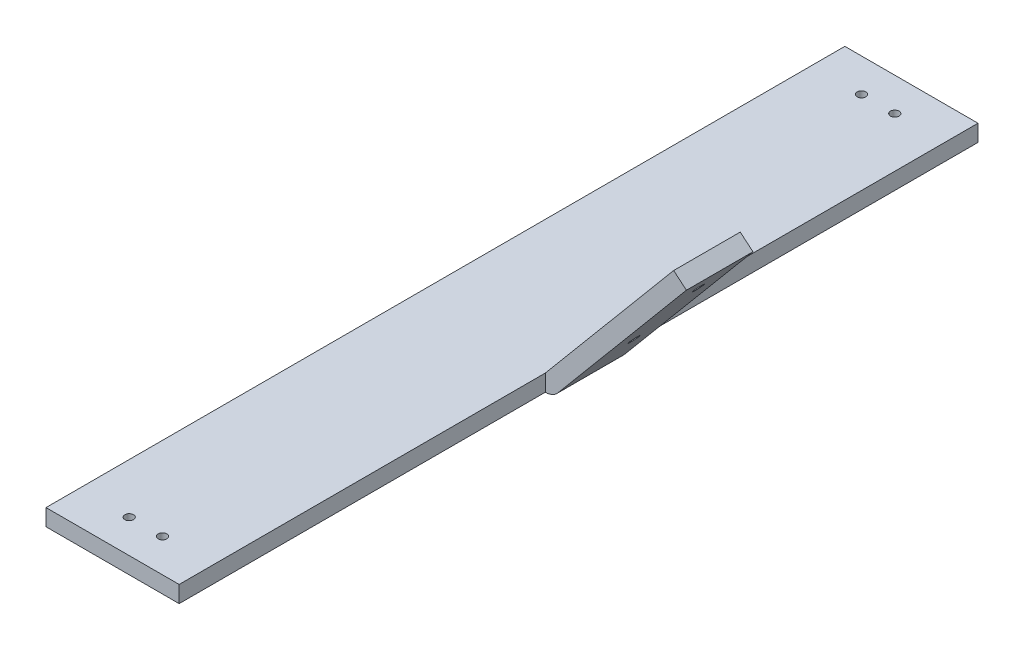
ISO-10303-21;
HEADER;
FILE_DESCRIPTION(('STEP AP214'),'2;1');
FILE_NAME('part.step','',(''),(''),'','','');
FILE_SCHEMA(('AUTOMOTIVE_DESIGN { 1 0 10303 214 1 1 1 1 }'));
ENDSEC;
DATA;
#1=APPLICATION_CONTEXT('core data for automotive mechanical design processes');
#2=APPLICATION_PROTOCOL_DEFINITION('international standard','automotive_design',2000,#1);
#3=PRODUCT_CONTEXT('',#1,'mechanical');
#4=PRODUCT('Part','Part','',(#3));
#5=PRODUCT_RELATED_PRODUCT_CATEGORY('part','',(#4));
#6=PRODUCT_DEFINITION_FORMATION('','',#4);
#7=PRODUCT_DEFINITION_CONTEXT('part definition',#1,'design');
#8=PRODUCT_DEFINITION('design','',#6,#7);
#9=PRODUCT_DEFINITION_SHAPE('','',#8);
#10=(LENGTH_UNIT() NAMED_UNIT(*) SI_UNIT(.MILLI.,.METRE.));
#11=(NAMED_UNIT(*) PLANE_ANGLE_UNIT() SI_UNIT($,.RADIAN.));
#12=(NAMED_UNIT(*) SI_UNIT($,.STERADIAN.) SOLID_ANGLE_UNIT());
#13=UNCERTAINTY_MEASURE_WITH_UNIT(LENGTH_MEASURE(1.E-05),#10,'distance_accuracy_value','');
#14=(GEOMETRIC_REPRESENTATION_CONTEXT(3) GLOBAL_UNCERTAINTY_ASSIGNED_CONTEXT((#13)) GLOBAL_UNIT_ASSIGNED_CONTEXT((#10,
#11,#12)) REPRESENTATION_CONTEXT('',''));
#15=CARTESIAN_POINT('',(0.,0.,0.));
#16=DIRECTION('',(0.,0.,1.));
#17=DIRECTION('',(1.,0.,0.));
#18=AXIS2_PLACEMENT_3D('',#15,#16,#17);
#19=CARTESIAN_POINT('',(50.8,0.,152.4));
#20=DIRECTION('',(-1.,0.,0.));
#21=DIRECTION('',(0.,0.,1.));
#22=AXIS2_PLACEMENT_3D('',#19,#20,#21);
#23=PLANE('',#22);
#24=DIRECTION('',(0.,1.,0.));
#25=VECTOR('',#24,1.);
#26=CARTESIAN_POINT('',(50.8,0.,-12.7));
#27=LINE('',#26,#25);
#28=CARTESIAN_POINT('',(50.8,-6.35,-12.7));
#29=VERTEX_POINT('',#28);
#30=CARTESIAN_POINT('',(50.8,0.,-12.7));
#31=VERTEX_POINT('',#30);
#32=EDGE_CURVE('E158',#29,#31,#27,.T.);
#33=ORIENTED_EDGE('',*,*,#32,.F.);
#34=DIRECTION('',(0.,0.,-1.));
#35=VECTOR('',#34,1.);
#36=CARTESIAN_POINT('',(50.8,-6.35,152.4));
#37=LINE('',#36,#35);
#38=CARTESIAN_POINT('',(50.8,-6.35,-152.4));
#39=VERTEX_POINT('',#38);
#40=EDGE_CURVE('E44',#29,#39,#37,.T.);
#41=ORIENTED_EDGE('',*,*,#40,.T.);
#42=DIRECTION('',(0.,1.,0.));
#43=VECTOR('',#42,1.);
#44=CARTESIAN_POINT('',(50.8,0.,-152.4));
#45=LINE('',#44,#43);
#46=CARTESIAN_POINT('',(50.8,0.,-152.4));
#47=VERTEX_POINT('',#46);
#48=EDGE_CURVE('E201',#39,#47,#45,.T.);
#49=ORIENTED_EDGE('',*,*,#48,.T.);
#50=DIRECTION('',(0.,0.,-1.));
#51=VECTOR('',#50,1.);
#52=CARTESIAN_POINT('',(50.8,0.,152.4));
#53=LINE('',#52,#51);
#54=EDGE_CURVE('E161',#31,#47,#53,.T.);
#55=ORIENTED_EDGE('',*,*,#54,.F.);
#56=EDGE_LOOP('',(#33,#41,#49,#55));
#57=FACE_BOUND('',#56,.T.);
#58=ADVANCED_FACE('F35',(#57),#23,.F.);
#59=CARTESIAN_POINT('',(0.,-6.35,152.4));
#60=DIRECTION('',(0.,1.,0.));
#61=DIRECTION('',(0.,0.,1.));
#62=AXIS2_PLACEMENT_3D('',#59,#60,#61);
#63=PLANE('',#62);
#64=CARTESIAN_POINT('',(19.0499999999999,-6.35,-139.7));
#65=DIRECTION('',(0.,1.,0.));
#66=DIRECTION('',(0.,0.,1.));
#67=AXIS2_PLACEMENT_3D('',#64,#65,#66);
#68=CIRCLE('',#67,1.651);
#69=CARTESIAN_POINT('',(19.0499999999999,-6.35,-138.049));
#70=VERTEX_POINT('',#69);
#71=EDGE_CURVE('E292',#70,#70,#68,.T.);
#72=ORIENTED_EDGE('',*,*,#71,.T.);
#73=EDGE_LOOP('',(#72));
#74=FACE_BOUND('',#73,.T.);
#75=CARTESIAN_POINT('',(31.75,-6.35,-139.7));
#76=DIRECTION('',(0.,1.,0.));
#77=DIRECTION('',(0.,0.,1.));
#78=AXIS2_PLACEMENT_3D('',#75,#76,#77);
#79=CIRCLE('',#78,1.651);
#80=CARTESIAN_POINT('',(31.75,-6.35,-138.049));
#81=VERTEX_POINT('',#80);
#82=EDGE_CURVE('E298',#81,#81,#79,.T.);
#83=ORIENTED_EDGE('',*,*,#82,.T.);
#84=EDGE_LOOP('',(#83));
#85=FACE_BOUND('',#84,.T.);
#86=CARTESIAN_POINT('',(31.75,-6.35,139.7));
#87=DIRECTION('',(0.,1.,0.));
#88=DIRECTION('',(0.,0.,1.));
#89=AXIS2_PLACEMENT_3D('',#86,#87,#88);
#90=CIRCLE('',#89,1.651);
#91=CARTESIAN_POINT('',(31.75,-6.35,141.351));
#92=VERTEX_POINT('',#91);
#93=EDGE_CURVE('E304',#92,#92,#90,.T.);
#94=ORIENTED_EDGE('',*,*,#93,.T.);
#95=EDGE_LOOP('',(#94));
#96=FACE_BOUND('',#95,.T.);
#97=CARTESIAN_POINT('',(19.05,-6.35,139.7));
#98=DIRECTION('',(0.,1.,0.));
#99=DIRECTION('',(0.,0.,1.));
#100=AXIS2_PLACEMENT_3D('',#97,#98,#99);
#101=CIRCLE('',#100,1.651);
#102=CARTESIAN_POINT('',(19.05,-6.35,141.351));
#103=VERTEX_POINT('',#102);
#104=EDGE_CURVE('E170',#103,#103,#101,.T.);
#105=ORIENTED_EDGE('',*,*,#104,.T.);
#106=EDGE_LOOP('',(#105));
#107=FACE_BOUND('',#106,.T.);
#108=DIRECTION('',(1.,0.,0.));
#109=VECTOR('',#108,1.);
#110=CARTESIAN_POINT('',(0.,-6.35,-152.4));
#111=LINE('',#110,#109);
#112=CARTESIAN_POINT('',(0.,-6.35,-152.4));
#113=VERTEX_POINT('',#112);
#114=EDGE_CURVE('E199',#113,#39,#111,.T.);
#115=ORIENTED_EDGE('',*,*,#114,.T.);
#116=ORIENTED_EDGE('',*,*,#40,.F.);
#117=DIRECTION('',(0.,0.,-1.));
#118=VECTOR('',#117,1.);
#119=CARTESIAN_POINT('',(50.8,-6.35,12.7));
#120=LINE('',#119,#118);
#121=CARTESIAN_POINT('',(50.8,-6.35,12.7));
#122=VERTEX_POINT('',#121);
#123=EDGE_CURVE('E121',#122,#29,#120,.T.);
#124=ORIENTED_EDGE('',*,*,#123,.F.);
#125=CARTESIAN_POINT('',(50.8,-6.35,152.4));
#126=VERTEX_POINT('',#125);
#127=EDGE_CURVE('E11',#126,#122,#37,.T.);
#128=ORIENTED_EDGE('',*,*,#127,.F.);
#129=DIRECTION('',(1.,0.,0.));
#130=VECTOR('',#129,1.);
#131=CARTESIAN_POINT('',(0.,-6.35,152.4));
#132=LINE('',#131,#130);
#133=CARTESIAN_POINT('',(0.,-6.35,152.4));
#134=VERTEX_POINT('',#133);
#135=EDGE_CURVE('E191',#134,#126,#132,.T.);
#136=ORIENTED_EDGE('',*,*,#135,.F.);
#137=DIRECTION('',(0.,0.,-1.));
#138=VECTOR('',#137,1.);
#139=CARTESIAN_POINT('',(0.,-6.35,152.4));
#140=LINE('',#139,#138);
#141=EDGE_CURVE('E198',#134,#113,#140,.T.);
#142=ORIENTED_EDGE('',*,*,#141,.T.);
#143=EDGE_LOOP('',(#115,#116,#124,#128,#136,#142));
#144=FACE_BOUND('',#143,.T.);
#145=ADVANCED_FACE('F37',(#74,#85,#96,#107,#144),#63,.F.);
#146=ORIENTED_EDGE('',*,*,#127,.T.);
#147=DIRECTION('',(0.,1.,0.));
#148=VECTOR('',#147,1.);
#149=CARTESIAN_POINT('',(50.8,0.,12.7));
#150=LINE('',#149,#148);
#151=CARTESIAN_POINT('',(50.8,0.,12.7000000000001));
#152=VERTEX_POINT('',#151);
#153=EDGE_CURVE('E127',#122,#152,#150,.T.);
#154=ORIENTED_EDGE('',*,*,#153,.T.);
#155=CARTESIAN_POINT('',(50.8,0.,152.4));
#156=VERTEX_POINT('',#155);
#157=EDGE_CURVE('E216',#156,#152,#53,.T.);
#158=ORIENTED_EDGE('',*,*,#157,.F.);
#159=DIRECTION('',(0.,1.,0.));
#160=VECTOR('',#159,1.);
#161=CARTESIAN_POINT('',(50.8,0.,152.4));
#162=LINE('',#161,#160);
#163=EDGE_CURVE('E89',#126,#156,#162,.T.);
#164=ORIENTED_EDGE('',*,*,#163,.F.);
#165=EDGE_LOOP('',(#146,#154,#158,#164));
#166=FACE_BOUND('',#165,.T.);
#167=ADVANCED_FACE('F140',(#166),#23,.F.);
#168=CARTESIAN_POINT('',(0.,0.,152.4));
#169=DIRECTION('',(0.,1.,0.));
#170=DIRECTION('',(0.,0.,1.));
#171=AXIS2_PLACEMENT_3D('',#168,#169,#170);
#172=PLANE('',#171);
#173=CARTESIAN_POINT('',(19.0499999999999,0.,-139.7));
#174=DIRECTION('',(0.,1.,0.));
#175=DIRECTION('',(0.,0.,-1.));
#176=AXIS2_PLACEMENT_3D('',#173,#174,#175);
#177=CIRCLE('',#176,1.651);
#178=CARTESIAN_POINT('',(19.0499999999999,0.,-141.351));
#179=VERTEX_POINT('',#178);
#180=EDGE_CURVE('E289',#179,#179,#177,.T.);
#181=ORIENTED_EDGE('',*,*,#180,.F.);
#182=EDGE_LOOP('',(#181));
#183=FACE_BOUND('',#182,.T.);
#184=CARTESIAN_POINT('',(31.75,0.,-139.7));
#185=DIRECTION('',(0.,1.,0.));
#186=DIRECTION('',(0.,0.,-1.));
#187=AXIS2_PLACEMENT_3D('',#184,#185,#186);
#188=CIRCLE('',#187,1.651);
#189=CARTESIAN_POINT('',(31.75,0.,-141.351));
#190=VERTEX_POINT('',#189);
#191=EDGE_CURVE('E295',#190,#190,#188,.T.);
#192=ORIENTED_EDGE('',*,*,#191,.F.);
#193=EDGE_LOOP('',(#192));
#194=FACE_BOUND('',#193,.T.);
#195=CARTESIAN_POINT('',(31.75,0.,139.7));
#196=DIRECTION('',(0.,1.,0.));
#197=DIRECTION('',(0.,0.,1.));
#198=AXIS2_PLACEMENT_3D('',#195,#196,#197);
#199=CIRCLE('',#198,1.651);
#200=CARTESIAN_POINT('',(31.75,0.,141.351));
#201=VERTEX_POINT('',#200);
#202=EDGE_CURVE('E301',#201,#201,#199,.T.);
#203=ORIENTED_EDGE('',*,*,#202,.F.);
#204=EDGE_LOOP('',(#203));
#205=FACE_BOUND('',#204,.T.);
#206=CARTESIAN_POINT('',(19.05,0.,139.7));
#207=DIRECTION('',(0.,1.,0.));
#208=DIRECTION('',(0.,0.,1.));
#209=AXIS2_PLACEMENT_3D('',#206,#207,#208);
#210=CIRCLE('',#209,1.651);
#211=CARTESIAN_POINT('',(19.05,0.,141.351));
#212=VERTEX_POINT('',#211);
#213=EDGE_CURVE('E307',#212,#212,#210,.T.);
#214=ORIENTED_EDGE('',*,*,#213,.F.);
#215=EDGE_LOOP('',(#214));
#216=FACE_BOUND('',#215,.T.);
#217=DIRECTION('',(1.,0.,0.));
#218=VECTOR('',#217,1.);
#219=CARTESIAN_POINT('',(0.,0.,-152.4));
#220=LINE('',#219,#218);
#221=CARTESIAN_POINT('',(0.,0.,-152.4));
#222=VERTEX_POINT('',#221);
#223=EDGE_CURVE('E203',#222,#47,#220,.T.);
#224=ORIENTED_EDGE('',*,*,#223,.F.);
#225=DIRECTION('',(0.,0.,-1.));
#226=VECTOR('',#225,1.);
#227=CARTESIAN_POINT('',(0.,0.,152.4));
#228=LINE('',#227,#226);
#229=CARTESIAN_POINT('',(0.,0.,152.4));
#230=VERTEX_POINT('',#229);
#231=EDGE_CURVE('E208',#230,#222,#228,.T.);
#232=ORIENTED_EDGE('',*,*,#231,.F.);
#233=DIRECTION('',(1.,0.,0.));
#234=VECTOR('',#233,1.);
#235=CARTESIAN_POINT('',(0.,0.,152.4));
#236=LINE('',#235,#234);
#237=EDGE_CURVE('E194',#230,#156,#236,.T.);
#238=ORIENTED_EDGE('',*,*,#237,.T.);
#239=ORIENTED_EDGE('',*,*,#157,.T.);
#240=DIRECTION('',(0.,0.,-1.));
#241=VECTOR('',#240,1.);
#242=CARTESIAN_POINT('',(50.8,0.,12.7));
#243=LINE('',#242,#241);
#244=EDGE_CURVE('E138',#152,#31,#243,.T.);
#245=ORIENTED_EDGE('',*,*,#244,.T.);
#246=ORIENTED_EDGE('',*,*,#54,.T.);
#247=EDGE_LOOP('',(#224,#232,#238,#239,#245,#246));
#248=FACE_BOUND('',#247,.T.);
#249=ADVANCED_FACE('F142',(#183,#194,#205,#216,#248),#172,.T.);
#250=CARTESIAN_POINT('',(0.,0.,152.4));
#251=DIRECTION('',(1.,0.,0.));
#252=DIRECTION('',(0.,1.,0.));
#253=AXIS2_PLACEMENT_3D('',#250,#251,#252);
#254=PLANE('',#253);
#255=DIRECTION('',(0.,-1.,0.));
#256=VECTOR('',#255,1.);
#257=CARTESIAN_POINT('',(0.,0.,-152.4));
#258=LINE('',#257,#256);
#259=EDGE_CURVE('E82',#222,#113,#258,.T.);
#260=ORIENTED_EDGE('',*,*,#259,.T.);
#261=ORIENTED_EDGE('',*,*,#141,.F.);
#262=DIRECTION('',(0.,-1.,0.));
#263=VECTOR('',#262,1.);
#264=CARTESIAN_POINT('',(0.,0.,152.4));
#265=LINE('',#264,#263);
#266=EDGE_CURVE('E61',#230,#134,#265,.T.);
#267=ORIENTED_EDGE('',*,*,#266,.F.);
#268=ORIENTED_EDGE('',*,*,#231,.T.);
#269=EDGE_LOOP('',(#260,#261,#267,#268));
#270=FACE_BOUND('',#269,.T.);
#271=ADVANCED_FACE('F147',(#270),#254,.F.);
#272=CARTESIAN_POINT('',(0.,0.,152.4));
#273=DIRECTION('',(0.,0.,1.));
#274=DIRECTION('',(1.,0.,0.));
#275=AXIS2_PLACEMENT_3D('',#272,#273,#274);
#276=PLANE('',#275);
#277=ORIENTED_EDGE('',*,*,#135,.T.);
#278=ORIENTED_EDGE('',*,*,#163,.T.);
#279=ORIENTED_EDGE('',*,*,#237,.F.);
#280=ORIENTED_EDGE('',*,*,#266,.T.);
#281=EDGE_LOOP('',(#277,#278,#279,#280));
#282=FACE_BOUND('',#281,.T.);
#283=ADVANCED_FACE('F223',(#282),#276,.T.);
#284=CARTESIAN_POINT('',(0.,0.,-152.4));
#285=DIRECTION('',(0.,0.,1.));
#286=DIRECTION('',(1.,0.,0.));
#287=AXIS2_PLACEMENT_3D('',#284,#285,#286);
#288=PLANE('',#287);
#289=ORIENTED_EDGE('',*,*,#114,.F.);
#290=ORIENTED_EDGE('',*,*,#259,.F.);
#291=ORIENTED_EDGE('',*,*,#223,.T.);
#292=ORIENTED_EDGE('',*,*,#48,.F.);
#293=EDGE_LOOP('',(#289,#290,#291,#292));
#294=FACE_BOUND('',#293,.T.);
#295=ADVANCED_FACE('F222',(#294),#288,.F.);
#296=CARTESIAN_POINT('',(29.8106637127402,-25.0141169265101,12.7));
#297=DIRECTION('',(-0.76604444311898,0.642787609686537,0.));
#298=DIRECTION('',(-0.642787609686537,-0.76604444311898,0.));
#299=AXIS2_PLACEMENT_3D('',#296,#297,#298);
#300=PLANE('',#299);
#301=CARTESIAN_POINT('',(67.126805286038,19.4575288552221,0.));
#302=DIRECTION('',(-0.76604444311898,0.642787609686537,0.));
#303=DIRECTION('',(-0.642787609686537,-0.76604444311898,0.));
#304=AXIS2_PLACEMENT_3D('',#301,#302,#303);
#305=CIRCLE('',#304,1.9304);
#306=CARTESIAN_POINT('',(65.8859680842992,17.9787566622252,0.));
#307=VERTEX_POINT('',#306);
#308=EDGE_CURVE('E280',#307,#307,#305,.T.);
#309=ORIENTED_EDGE('',*,*,#308,.F.);
#310=EDGE_LOOP('',(#309));
#311=FACE_BOUND('',#310,.T.);
#312=CARTESIAN_POINT('',(91.6170132150951,48.6438221380552,0.));
#313=DIRECTION('',(-0.76604444311898,0.642787609686537,0.));
#314=DIRECTION('',(-0.642787609686537,-0.76604444311898,0.));
#315=AXIS2_PLACEMENT_3D('',#312,#313,#314);
#316=CIRCLE('',#315,1.93039999999999);
#317=CARTESIAN_POINT('',(90.3761760133562,47.1650499450584,0.));
#318=VERTEX_POINT('',#317);
#319=EDGE_CURVE('E283',#318,#318,#316,.T.);
#320=ORIENTED_EDGE('',*,*,#319,.F.);
#321=EDGE_LOOP('',(#320));
#322=FACE_BOUND('',#321,.T.);
#323=DIRECTION('',(0.642787609686537,0.76604444311898,0.));
#324=VECTOR('',#323,1.);
#325=CARTESIAN_POINT('',(29.8106637127402,-25.0141169265101,-12.7));
#326=LINE('',#325,#324);
#327=CARTESIAN_POINT('',(99.7804158581142,58.3725865656663,-12.7));
#328=VERTEX_POINT('',#327);
#329=EDGE_CURVE('E166',#31,#328,#326,.T.);
#330=ORIENTED_EDGE('',*,*,#329,.F.);
#331=ORIENTED_EDGE('',*,*,#244,.F.);
#332=DIRECTION('',(0.642787609686537,0.76604444311898,0.));
#333=VECTOR('',#332,1.);
#334=CARTESIAN_POINT('',(29.8106637127402,-25.0141169265101,12.7));
#335=LINE('',#334,#333);
#336=CARTESIAN_POINT('',(99.7804158581142,58.3725865656663,12.7));
#337=VERTEX_POINT('',#336);
#338=EDGE_CURVE('E52',#152,#337,#335,.T.);
#339=ORIENTED_EDGE('',*,*,#338,.T.);
#340=DIRECTION('',(0.,0.,-1.));
#341=VECTOR('',#340,1.);
#342=CARTESIAN_POINT('',(99.7804158581142,58.3725865656663,12.7));
#343=LINE('',#342,#341);
#344=EDGE_CURVE('E186',#337,#328,#343,.T.);
#345=ORIENTED_EDGE('',*,*,#344,.T.);
#346=EDGE_LOOP('',(#330,#331,#339,#345));
#347=FACE_BOUND('',#346,.T.);
#348=ADVANCED_FACE('F230',(#311,#322,#347),#300,.T.);
#349=CARTESIAN_POINT('',(50.8,0.,12.7));
#350=DIRECTION('',(0.,0.,-1.));
#351=DIRECTION('',(-1.,0.,0.));
#352=AXIS2_PLACEMENT_3D('',#349,#350,#351);
#353=CYLINDRICAL_SURFACE('',#352,6.35);
#354=CARTESIAN_POINT('',(50.8,0.,-12.7));
#355=DIRECTION('',(0.,0.,1.));
#356=DIRECTION('',(1.,0.,0.));
#357=AXIS2_PLACEMENT_3D('',#354,#355,#356);
#358=CIRCLE('',#357,6.35);
#359=CARTESIAN_POINT('',(55.6643822138055,-4.08170132150951,-12.7));
#360=VERTEX_POINT('',#359);
#361=EDGE_CURVE('E165',#29,#360,#358,.T.);
#362=ORIENTED_EDGE('',*,*,#361,.T.);
#363=DIRECTION('',(0.,0.,-1.));
#364=VECTOR('',#363,1.);
#365=CARTESIAN_POINT('',(55.6643822138055,-4.08170132150951,12.7));
#366=LINE('',#365,#364);
#367=CARTESIAN_POINT('',(55.6643822138055,-4.08170132150951,12.7));
#368=VERTEX_POINT('',#367);
#369=EDGE_CURVE('E124',#368,#360,#366,.T.);
#370=ORIENTED_EDGE('',*,*,#369,.F.);
#371=CARTESIAN_POINT('',(50.8,0.,12.7));
#372=DIRECTION('',(0.,0.,1.));
#373=DIRECTION('',(1.,0.,0.));
#374=AXIS2_PLACEMENT_3D('',#371,#372,#373);
#375=CIRCLE('',#374,6.35);
#376=EDGE_CURVE('E118',#122,#368,#375,.T.);
#377=ORIENTED_EDGE('',*,*,#376,.F.);
#378=ORIENTED_EDGE('',*,*,#123,.T.);
#379=EDGE_LOOP('',(#362,#370,#377,#378));
#380=FACE_BOUND('',#379,.T.);
#381=ADVANCED_FACE('F119',(#380),#353,.T.);
#382=CARTESIAN_POINT('',(34.6750459265457,-29.0958182480196,12.7));
#383=DIRECTION('',(-0.76604444311898,0.642787609686537,0.));
#384=DIRECTION('',(-0.642787609686537,-0.76604444311898,0.));
#385=AXIS2_PLACEMENT_3D('',#382,#383,#384);
#386=PLANE('',#385);
#387=CARTESIAN_POINT('',(71.9911874998436,15.3758275337126,0.));
#388=DIRECTION('',(-0.76604444311898,0.642787609686537,0.));
#389=DIRECTION('',(-0.642787609686537,-0.76604444311898,0.));
#390=AXIS2_PLACEMENT_3D('',#387,#388,#389);
#391=CIRCLE('',#390,1.9304);
#392=CARTESIAN_POINT('',(70.7503502981047,13.8970553407157,0.));
#393=VERTEX_POINT('',#392);
#394=EDGE_CURVE('E39',#393,#393,#391,.T.);
#395=ORIENTED_EDGE('',*,*,#394,.T.);
#396=EDGE_LOOP('',(#395));
#397=FACE_BOUND('',#396,.T.);
#398=CARTESIAN_POINT('',(96.4813954289007,44.5621208165457,0.));
#399=DIRECTION('',(-0.76604444311898,0.642787609686537,0.));
#400=DIRECTION('',(-0.642787609686537,-0.76604444311898,0.));
#401=AXIS2_PLACEMENT_3D('',#398,#399,#400);
#402=CIRCLE('',#401,1.93039999999999);
#403=CARTESIAN_POINT('',(95.2405582271618,43.0833486235489,0.));
#404=VERTEX_POINT('',#403);
#405=EDGE_CURVE('E285',#404,#404,#402,.T.);
#406=ORIENTED_EDGE('',*,*,#405,.T.);
#407=EDGE_LOOP('',(#406));
#408=FACE_BOUND('',#407,.T.);
#409=DIRECTION('',(0.642787609686537,0.76604444311898,0.));
#410=VECTOR('',#409,1.);
#411=CARTESIAN_POINT('',(34.6750459265457,-29.0958182480196,-12.7));
#412=LINE('',#411,#410);
#413=CARTESIAN_POINT('',(104.64479807192,54.2908852441568,-12.7));
#414=VERTEX_POINT('',#413);
#415=EDGE_CURVE('E168',#360,#414,#412,.T.);
#416=ORIENTED_EDGE('',*,*,#415,.T.);
#417=DIRECTION('',(0.,0.,-1.));
#418=VECTOR('',#417,1.);
#419=CARTESIAN_POINT('',(104.64479807192,54.2908852441568,12.7));
#420=LINE('',#419,#418);
#421=CARTESIAN_POINT('',(104.64479807192,54.2908852441568,12.7));
#422=VERTEX_POINT('',#421);
#423=EDGE_CURVE('E188',#422,#414,#420,.T.);
#424=ORIENTED_EDGE('',*,*,#423,.F.);
#425=DIRECTION('',(0.642787609686537,0.76604444311898,0.));
#426=VECTOR('',#425,1.);
#427=CARTESIAN_POINT('',(34.6750459265457,-29.0958182480196,12.7));
#428=LINE('',#427,#426);
#429=EDGE_CURVE('E126',#368,#422,#428,.T.);
#430=ORIENTED_EDGE('',*,*,#429,.F.);
#431=ORIENTED_EDGE('',*,*,#369,.T.);
#432=EDGE_LOOP('',(#416,#424,#430,#431));
#433=FACE_BOUND('',#432,.T.);
#434=ADVANCED_FACE('F239',(#397,#408,#433),#386,.F.);
#435=CARTESIAN_POINT('',(69.9697521453737,83.3867034921764,12.7));
#436=DIRECTION('',(0.642787609686535,0.766044443118981,0.));
#437=DIRECTION('',(-0.766044443118981,0.642787609686535,0.));
#438=AXIS2_PLACEMENT_3D('',#435,#436,#437);
#439=PLANE('',#438);
#440=DIRECTION('',(0.766044443118981,-0.642787609686536,0.));
#441=VECTOR('',#440,1.);
#442=CARTESIAN_POINT('',(69.9697521453737,83.3867034921764,-12.7));
#443=LINE('',#442,#441);
#444=EDGE_CURVE('E183',#328,#414,#443,.T.);
#445=ORIENTED_EDGE('',*,*,#444,.F.);
#446=ORIENTED_EDGE('',*,*,#344,.F.);
#447=DIRECTION('',(0.766044443118981,-0.642787609686536,0.));
#448=VECTOR('',#447,1.);
#449=CARTESIAN_POINT('',(69.9697521453737,83.3867034921764,12.7));
#450=LINE('',#449,#448);
#451=EDGE_CURVE('E179',#337,#422,#450,.T.);
#452=ORIENTED_EDGE('',*,*,#451,.T.);
#453=ORIENTED_EDGE('',*,*,#423,.T.);
#454=EDGE_LOOP('',(#445,#446,#452,#453));
#455=FACE_BOUND('',#454,.T.);
#456=ADVANCED_FACE('F242',(#455),#439,.T.);
#457=CARTESIAN_POINT('',(0.,0.,12.7));
#458=DIRECTION('',(0.,0.,1.));
#459=DIRECTION('',(1.,0.,0.));
#460=AXIS2_PLACEMENT_3D('',#457,#458,#459);
#461=PLANE('',#460);
#462=ORIENTED_EDGE('',*,*,#338,.F.);
#463=ORIENTED_EDGE('',*,*,#153,.F.);
#464=ORIENTED_EDGE('',*,*,#376,.T.);
#465=ORIENTED_EDGE('',*,*,#429,.T.);
#466=ORIENTED_EDGE('',*,*,#451,.F.);
#467=EDGE_LOOP('',(#462,#463,#464,#465,#466));
#468=FACE_BOUND('',#467,.T.);
#469=ADVANCED_FACE('F130',(#468),#461,.T.);
#470=CARTESIAN_POINT('',(0.,0.,-12.7));
#471=DIRECTION('',(0.,0.,1.));
#472=DIRECTION('',(1.,0.,0.));
#473=AXIS2_PLACEMENT_3D('',#470,#471,#472);
#474=PLANE('',#473);
#475=ORIENTED_EDGE('',*,*,#329,.T.);
#476=ORIENTED_EDGE('',*,*,#444,.T.);
#477=ORIENTED_EDGE('',*,*,#415,.F.);
#478=ORIENTED_EDGE('',*,*,#361,.F.);
#479=ORIENTED_EDGE('',*,*,#32,.T.);
#480=EDGE_LOOP('',(#475,#476,#477,#478,#479));
#481=FACE_BOUND('',#480,.T.);
#482=ADVANCED_FACE('F247',(#481),#474,.F.);
#483=CARTESIAN_POINT('',(19.05,-25.4,139.7));
#484=DIRECTION('',(0.,1.,0.));
#485=DIRECTION('',(0.,0.,1.));
#486=AXIS2_PLACEMENT_3D('',#483,#484,#485);
#487=CYLINDRICAL_SURFACE('',#486,1.651);
#488=ORIENTED_EDGE('',*,*,#213,.T.);
#489=EDGE_LOOP('',(#488));
#490=FACE_BOUND('',#489,.T.);
#491=ORIENTED_EDGE('',*,*,#104,.F.);
#492=EDGE_LOOP('',(#491));
#493=FACE_BOUND('',#492,.T.);
#494=ADVANCED_FACE('F250',(#490,#493),#487,.F.);
#495=CARTESIAN_POINT('',(31.75,-25.4,139.7));
#496=DIRECTION('',(0.,1.,0.));
#497=DIRECTION('',(0.,0.,1.));
#498=AXIS2_PLACEMENT_3D('',#495,#496,#497);
#499=CYLINDRICAL_SURFACE('',#498,1.651);
#500=ORIENTED_EDGE('',*,*,#202,.T.);
#501=EDGE_LOOP('',(#500));
#502=FACE_BOUND('',#501,.T.);
#503=ORIENTED_EDGE('',*,*,#93,.F.);
#504=EDGE_LOOP('',(#503));
#505=FACE_BOUND('',#504,.T.);
#506=ADVANCED_FACE('F255',(#502,#505),#499,.F.);
#507=CARTESIAN_POINT('',(31.75,-25.4,-139.7));
#508=DIRECTION('',(0.,1.,0.));
#509=DIRECTION('',(0.,0.,1.));
#510=AXIS2_PLACEMENT_3D('',#507,#508,#509);
#511=CYLINDRICAL_SURFACE('',#510,1.651);
#512=ORIENTED_EDGE('',*,*,#191,.T.);
#513=EDGE_LOOP('',(#512));
#514=FACE_BOUND('',#513,.T.);
#515=ORIENTED_EDGE('',*,*,#82,.F.);
#516=EDGE_LOOP('',(#515));
#517=FACE_BOUND('',#516,.T.);
#518=ADVANCED_FACE('F259',(#514,#517),#511,.F.);
#519=CARTESIAN_POINT('',(19.0499999999999,-25.4,-139.7));
#520=DIRECTION('',(0.,1.,0.));
#521=DIRECTION('',(0.,0.,1.));
#522=AXIS2_PLACEMENT_3D('',#519,#520,#521);
#523=CYLINDRICAL_SURFACE('',#522,1.651);
#524=ORIENTED_EDGE('',*,*,#180,.T.);
#525=EDGE_LOOP('',(#524));
#526=FACE_BOUND('',#525,.T.);
#527=ORIENTED_EDGE('',*,*,#71,.F.);
#528=EDGE_LOOP('',(#527));
#529=FACE_BOUND('',#528,.T.);
#530=ADVANCED_FACE('F263',(#526,#529),#523,.F.);
#531=CARTESIAN_POINT('',(111.074542070317,32.3170168520172,0.));
#532=DIRECTION('',(-0.76604444311898,0.642787609686537,0.));
#533=DIRECTION('',(-0.642787609686537,-0.76604444311898,0.));
#534=AXIS2_PLACEMENT_3D('',#531,#532,#533);
#535=CYLINDRICAL_SURFACE('',#534,1.93039999999999);
#536=ORIENTED_EDGE('',*,*,#319,.T.);
#537=EDGE_LOOP('',(#536));
#538=FACE_BOUND('',#537,.T.);
#539=ORIENTED_EDGE('',*,*,#405,.F.);
#540=EDGE_LOOP('',(#539));
#541=FACE_BOUND('',#540,.T.);
#542=ADVANCED_FACE('F267',(#538,#541),#535,.F.);
#543=CARTESIAN_POINT('',(86.5843341412601,3.13072356918406,0.));
#544=DIRECTION('',(-0.76604444311898,0.642787609686537,0.));
#545=DIRECTION('',(-0.642787609686537,-0.76604444311898,0.));
#546=AXIS2_PLACEMENT_3D('',#543,#544,#545);
#547=CYLINDRICAL_SURFACE('',#546,1.9304);
#548=ORIENTED_EDGE('',*,*,#308,.T.);
#549=EDGE_LOOP('',(#548));
#550=FACE_BOUND('',#549,.T.);
#551=ORIENTED_EDGE('',*,*,#394,.F.);
#552=EDGE_LOOP('',(#551));
#553=FACE_BOUND('',#552,.T.);
#554=ADVANCED_FACE('F271',(#550,#553),#547,.F.);
#555=CLOSED_SHELL('',(#58,#145,#167,#249,#271,#283,#295,#348,#381,#434,#456,#469,#482,#494,#506,
#518,#530,#542,#554));
#556=MANIFOLD_SOLID_BREP('B2',#555);
#557=ADVANCED_BREP_SHAPE_REPRESENTATION('',(#18,#556),#14);
#558=SHAPE_DEFINITION_REPRESENTATION(#9,#557);
ENDSEC;
END-ISO-10303-21;
